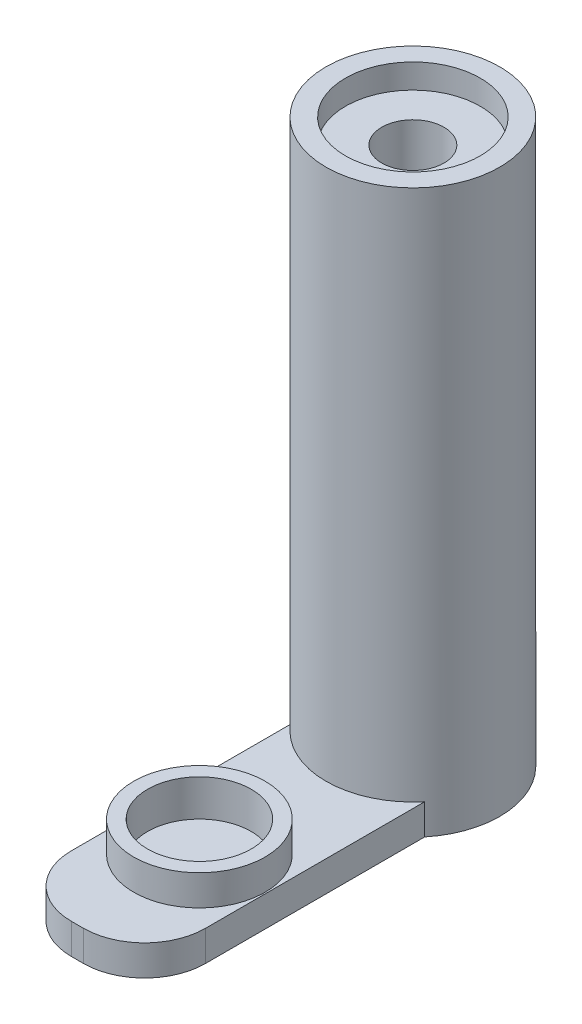
ISO-10303-21;
HEADER;
FILE_DESCRIPTION(('STEP AP214'),'2;1');
FILE_NAME('part.step','',(''),(''),'','','');
FILE_SCHEMA(('AUTOMOTIVE_DESIGN { 1 0 10303 214 1 1 1 1 }'));
ENDSEC;
DATA;
#1=APPLICATION_CONTEXT('core data for automotive mechanical design processes');
#2=APPLICATION_PROTOCOL_DEFINITION('international standard','automotive_design',2000,#1);
#3=PRODUCT_CONTEXT('',#1,'mechanical');
#4=PRODUCT('Part','Part','',(#3));
#5=PRODUCT_RELATED_PRODUCT_CATEGORY('part','',(#4));
#6=PRODUCT_DEFINITION_FORMATION('','',#4);
#7=PRODUCT_DEFINITION_CONTEXT('part definition',#1,'design');
#8=PRODUCT_DEFINITION('design','',#6,#7);
#9=PRODUCT_DEFINITION_SHAPE('','',#8);
#10=(LENGTH_UNIT() NAMED_UNIT(*) SI_UNIT(.MILLI.,.METRE.));
#11=(NAMED_UNIT(*) PLANE_ANGLE_UNIT() SI_UNIT($,.RADIAN.));
#12=(NAMED_UNIT(*) SI_UNIT($,.STERADIAN.) SOLID_ANGLE_UNIT());
#13=UNCERTAINTY_MEASURE_WITH_UNIT(LENGTH_MEASURE(1.E-05),#10,'distance_accuracy_value','');
#14=(GEOMETRIC_REPRESENTATION_CONTEXT(3) GLOBAL_UNCERTAINTY_ASSIGNED_CONTEXT((#13)) GLOBAL_UNIT_ASSIGNED_CONTEXT((#10,
#11,#12)) REPRESENTATION_CONTEXT('',''));
#15=CARTESIAN_POINT('',(0.,0.,0.));
#16=DIRECTION('',(0.,0.,1.));
#17=DIRECTION('',(1.,0.,0.));
#18=AXIS2_PLACEMENT_3D('',#15,#16,#17);
#19=CARTESIAN_POINT('',(0.,5.,0.));
#20=DIRECTION('',(0.,-1.,0.));
#21=DIRECTION('',(0.,0.,-1.));
#22=AXIS2_PLACEMENT_3D('',#19,#20,#21);
#23=PLANE('',#22);
#24=DIRECTION('',(0.,0.,-1.));
#25=VECTOR('',#24,1.);
#26=CARTESIAN_POINT('',(-11.,5.,55.));
#27=LINE('',#26,#25);
#28=CARTESIAN_POINT('',(-11.,5.,45.));
#29=VERTEX_POINT('',#28);
#30=CARTESIAN_POINT('',(-11.,5.,9.05883546599672));
#31=VERTEX_POINT('',#30);
#32=EDGE_CURVE('E119',#29,#31,#27,.T.);
#33=ORIENTED_EDGE('',*,*,#32,.F.);
#34=CARTESIAN_POINT('',(-1.,5.,45.));
#35=DIRECTION('',(0.,-1.,0.));
#36=DIRECTION('',(0.,0.,-1.));
#37=AXIS2_PLACEMENT_3D('',#34,#35,#36);
#38=CIRCLE('',#37,10.);
#39=CARTESIAN_POINT('',(-1.,5.,55.));
#40=VERTEX_POINT('',#39);
#41=EDGE_CURVE('E179',#29,#40,#38,.F.);
#42=ORIENTED_EDGE('',*,*,#41,.T.);
#43=DIRECTION('',(-1.,0.,0.));
#44=VECTOR('',#43,1.);
#45=CARTESIAN_POINT('',(-11.,5.,55.));
#46=LINE('',#45,#44);
#47=CARTESIAN_POINT('',(0.999999999999997,5.,55.));
#48=VERTEX_POINT('',#47);
#49=EDGE_CURVE('E184',#48,#40,#46,.T.);
#50=ORIENTED_EDGE('',*,*,#49,.F.);
#51=CARTESIAN_POINT('',(0.999999999999997,5.,45.));
#52=DIRECTION('',(0.,-1.,0.));
#53=DIRECTION('',(0.,0.,-1.));
#54=AXIS2_PLACEMENT_3D('',#51,#52,#53);
#55=CIRCLE('',#54,10.);
#56=CARTESIAN_POINT('',(11.,5.,45.));
#57=VERTEX_POINT('',#56);
#58=EDGE_CURVE('E55',#48,#57,#55,.F.);
#59=ORIENTED_EDGE('',*,*,#58,.T.);
#60=DIRECTION('',(0.,0.,1.));
#61=VECTOR('',#60,1.);
#62=CARTESIAN_POINT('',(11.,5.,55.));
#63=LINE('',#62,#61);
#64=CARTESIAN_POINT('',(11.,5.,9.05883546599672));
#65=VERTEX_POINT('',#64);
#66=EDGE_CURVE('E139',#65,#57,#63,.T.);
#67=ORIENTED_EDGE('',*,*,#66,.F.);
#68=CARTESIAN_POINT('',(0.,5.,0.));
#69=DIRECTION('',(0.,-1.,0.));
#70=DIRECTION('',(0.,0.,-1.));
#71=AXIS2_PLACEMENT_3D('',#68,#69,#70);
#72=CIRCLE('',#71,14.25);
#73=EDGE_CURVE('E115',#65,#31,#72,.T.);
#74=ORIENTED_EDGE('',*,*,#73,.T.);
#75=EDGE_LOOP('',(#33,#42,#50,#59,#67,#74));
#76=FACE_BOUND('',#75,.T.);
#77=CARTESIAN_POINT('',(0.,5.,35.));
#78=DIRECTION('',(0.,-1.,0.));
#79=DIRECTION('',(0.,0.,-1.));
#80=AXIS2_PLACEMENT_3D('',#77,#78,#79);
#81=CIRCLE('',#80,10.7734880242537);
#82=CARTESIAN_POINT('',(0.,5.,24.2265119757463));
#83=VERTEX_POINT('',#82);
#84=EDGE_CURVE('E11',#83,#83,#81,.F.);
#85=ORIENTED_EDGE('',*,*,#84,.F.);
#86=EDGE_LOOP('',(#85));
#87=FACE_BOUND('',#86,.T.);
#88=ADVANCED_FACE('F39',(#76,#87),#23,.F.);
#89=CARTESIAN_POINT('',(0.,0.,0.));
#90=DIRECTION('',(0.,1.,0.));
#91=DIRECTION('',(0.,0.,1.));
#92=AXIS2_PLACEMENT_3D('',#89,#90,#91);
#93=CYLINDRICAL_SURFACE('',#92,5.1);
#94=CARTESIAN_POINT('',(0.,88.2,0.));
#95=DIRECTION('',(0.,1.,0.));
#96=DIRECTION('',(0.,0.,1.));
#97=AXIS2_PLACEMENT_3D('',#94,#95,#96);
#98=CIRCLE('',#97,5.1);
#99=CARTESIAN_POINT('',(0.,88.2,5.1));
#100=VERTEX_POINT('',#99);
#101=EDGE_CURVE('E108',#100,#100,#98,.F.);
#102=ORIENTED_EDGE('',*,*,#101,.F.);
#103=EDGE_LOOP('',(#102));
#104=FACE_BOUND('',#103,.T.);
#105=CARTESIAN_POINT('',(0.,5.,0.));
#106=DIRECTION('',(0.,-1.,0.));
#107=DIRECTION('',(0.,0.,-1.));
#108=AXIS2_PLACEMENT_3D('',#105,#106,#107);
#109=CIRCLE('',#108,5.1);
#110=CARTESIAN_POINT('',(0.,5.,-5.1));
#111=VERTEX_POINT('',#110);
#112=EDGE_CURVE('E143',#111,#111,#109,.F.);
#113=ORIENTED_EDGE('',*,*,#112,.F.);
#114=EDGE_LOOP('',(#113));
#115=FACE_BOUND('',#114,.T.);
#116=ADVANCED_FACE('F214',(#104,#115),#93,.F.);
#117=CARTESIAN_POINT('',(0.,92.2,0.));
#118=DIRECTION('',(0.,-1.,0.));
#119=DIRECTION('',(0.,0.,-1.));
#120=AXIS2_PLACEMENT_3D('',#117,#118,#119);
#121=CYLINDRICAL_SURFACE('',#120,14.25);
#122=CARTESIAN_POINT('',(0.,0.,0.));
#123=DIRECTION('',(0.,1.,0.));
#124=DIRECTION('',(0.,0.,1.));
#125=AXIS2_PLACEMENT_3D('',#122,#123,#124);
#126=CIRCLE('',#125,14.25);
#127=CARTESIAN_POINT('',(11.,0.,9.05883546599672));
#128=VERTEX_POINT('',#127);
#129=CARTESIAN_POINT('',(-11.,0.,9.05883546599672));
#130=VERTEX_POINT('',#129);
#131=EDGE_CURVE('E96',#128,#130,#126,.T.);
#132=ORIENTED_EDGE('',*,*,#131,.T.);
#133=DIRECTION('',(0.,-1.,0.));
#134=VECTOR('',#133,1.);
#135=CARTESIAN_POINT('',(-11.,5.,9.05883546599672));
#136=LINE('',#135,#134);
#137=EDGE_CURVE('E118',#31,#130,#136,.T.);
#138=ORIENTED_EDGE('',*,*,#137,.F.);
#139=ORIENTED_EDGE('',*,*,#73,.F.);
#140=DIRECTION('',(0.,-1.,0.));
#141=VECTOR('',#140,1.);
#142=CARTESIAN_POINT('',(11.,5.,9.05883546599672));
#143=LINE('',#142,#141);
#144=EDGE_CURVE('E111',#65,#128,#143,.T.);
#145=ORIENTED_EDGE('',*,*,#144,.T.);
#146=EDGE_LOOP('',(#132,#138,#139,#145));
#147=FACE_BOUND('',#146,.T.);
#148=CARTESIAN_POINT('',(0.,92.2,0.));
#149=DIRECTION('',(0.,1.,0.));
#150=DIRECTION('',(0.,0.,1.));
#151=AXIS2_PLACEMENT_3D('',#148,#149,#150);
#152=CIRCLE('',#151,14.25);
#153=CARTESIAN_POINT('',(0.,92.2,14.25));
#154=VERTEX_POINT('',#153);
#155=EDGE_CURVE('E107',#154,#154,#152,.T.);
#156=ORIENTED_EDGE('',*,*,#155,.F.);
#157=EDGE_LOOP('',(#156));
#158=FACE_BOUND('',#157,.T.);
#159=ADVANCED_FACE('F112',(#147,#158),#121,.T.);
#160=CARTESIAN_POINT('',(0.,92.2,0.));
#161=DIRECTION('',(0.,1.,0.));
#162=DIRECTION('',(0.,0.,1.));
#163=AXIS2_PLACEMENT_3D('',#160,#161,#162);
#164=PLANE('',#163);
#165=CARTESIAN_POINT('',(0.,92.2,0.));
#166=DIRECTION('',(0.,1.,0.));
#167=DIRECTION('',(0.,0.,1.));
#168=AXIS2_PLACEMENT_3D('',#165,#166,#167);
#169=CIRCLE('',#168,11.05);
#170=CARTESIAN_POINT('',(0.,92.2,11.05));
#171=VERTEX_POINT('',#170);
#172=EDGE_CURVE('E141',#171,#171,#169,.T.);
#173=ORIENTED_EDGE('',*,*,#172,.F.);
#174=EDGE_LOOP('',(#173));
#175=FACE_BOUND('',#174,.T.);
#176=ORIENTED_EDGE('',*,*,#155,.T.);
#177=EDGE_LOOP('',(#176));
#178=FACE_BOUND('',#177,.T.);
#179=ADVANCED_FACE('F252',(#175,#178),#164,.T.);
#180=CARTESIAN_POINT('',(0.,0.,0.));
#181=DIRECTION('',(0.,1.,0.));
#182=DIRECTION('',(0.,0.,1.));
#183=AXIS2_PLACEMENT_3D('',#180,#181,#182);
#184=PLANE('',#183);
#185=DIRECTION('',(-1.,0.,0.));
#186=VECTOR('',#185,1.);
#187=CARTESIAN_POINT('',(-11.,0.,55.));
#188=LINE('',#187,#186);
#189=CARTESIAN_POINT('',(0.999999999999997,0.,55.));
#190=VERTEX_POINT('',#189);
#191=CARTESIAN_POINT('',(-1.,0.,55.));
#192=VERTEX_POINT('',#191);
#193=EDGE_CURVE('E125',#190,#192,#188,.T.);
#194=ORIENTED_EDGE('',*,*,#193,.T.);
#195=CARTESIAN_POINT('',(-1.,0.,45.));
#196=DIRECTION('',(0.,1.,0.));
#197=DIRECTION('',(0.,0.,1.));
#198=AXIS2_PLACEMENT_3D('',#195,#196,#197);
#199=CIRCLE('',#198,10.);
#200=CARTESIAN_POINT('',(-11.,0.,45.));
#201=VERTEX_POINT('',#200);
#202=EDGE_CURVE('E172',#192,#201,#199,.F.);
#203=ORIENTED_EDGE('',*,*,#202,.T.);
#204=DIRECTION('',(0.,0.,-1.));
#205=VECTOR('',#204,1.);
#206=CARTESIAN_POINT('',(-11.,0.,55.));
#207=LINE('',#206,#205);
#208=EDGE_CURVE('E102',#201,#130,#207,.T.);
#209=ORIENTED_EDGE('',*,*,#208,.T.);
#210=ORIENTED_EDGE('',*,*,#131,.F.);
#211=DIRECTION('',(0.,0.,1.));
#212=VECTOR('',#211,1.);
#213=CARTESIAN_POINT('',(11.,0.,55.));
#214=LINE('',#213,#212);
#215=CARTESIAN_POINT('',(11.,0.,45.));
#216=VERTEX_POINT('',#215);
#217=EDGE_CURVE('E101',#128,#216,#214,.T.);
#218=ORIENTED_EDGE('',*,*,#217,.T.);
#219=CARTESIAN_POINT('',(0.999999999999997,0.,45.));
#220=DIRECTION('',(0.,1.,0.));
#221=DIRECTION('',(0.,0.,1.));
#222=AXIS2_PLACEMENT_3D('',#219,#220,#221);
#223=CIRCLE('',#222,10.);
#224=EDGE_CURVE('E169',#216,#190,#223,.F.);
#225=ORIENTED_EDGE('',*,*,#224,.T.);
#226=EDGE_LOOP('',(#194,#203,#209,#210,#218,#225));
#227=FACE_BOUND('',#226,.T.);
#228=ADVANCED_FACE('F99',(#227),#184,.F.);
#229=CARTESIAN_POINT('',(0.,88.2,0.));
#230=DIRECTION('',(0.,1.,0.));
#231=DIRECTION('',(0.,0.,1.));
#232=AXIS2_PLACEMENT_3D('',#229,#230,#231);
#233=PLANE('',#232);
#234=CARTESIAN_POINT('',(0.,88.2,0.));
#235=DIRECTION('',(0.,1.,0.));
#236=DIRECTION('',(0.,0.,1.));
#237=AXIS2_PLACEMENT_3D('',#234,#235,#236);
#238=CIRCLE('',#237,11.05);
#239=CARTESIAN_POINT('',(0.,88.2,11.05));
#240=VERTEX_POINT('',#239);
#241=EDGE_CURVE('E148',#240,#240,#238,.T.);
#242=ORIENTED_EDGE('',*,*,#241,.T.);
#243=EDGE_LOOP('',(#242));
#244=FACE_BOUND('',#243,.T.);
#245=ORIENTED_EDGE('',*,*,#101,.T.);
#246=EDGE_LOOP('',(#245));
#247=FACE_BOUND('',#246,.T.);
#248=ADVANCED_FACE('F245',(#244,#247),#233,.T.);
#249=CARTESIAN_POINT('',(0.,88.2,0.));
#250=DIRECTION('',(0.,1.,0.));
#251=DIRECTION('',(0.,0.,1.));
#252=AXIS2_PLACEMENT_3D('',#249,#250,#251);
#253=CYLINDRICAL_SURFACE('',#252,11.05);
#254=ORIENTED_EDGE('',*,*,#241,.F.);
#255=EDGE_LOOP('',(#254));
#256=FACE_BOUND('',#255,.T.);
#257=ORIENTED_EDGE('',*,*,#172,.T.);
#258=EDGE_LOOP('',(#257));
#259=FACE_BOUND('',#258,.T.);
#260=ADVANCED_FACE('F244',(#256,#259),#253,.F.);
#261=CARTESIAN_POINT('',(11.,5.,55.));
#262=DIRECTION('',(1.,0.,0.));
#263=DIRECTION('',(0.,0.,-1.));
#264=AXIS2_PLACEMENT_3D('',#261,#262,#263);
#265=PLANE('',#264);
#266=ORIENTED_EDGE('',*,*,#66,.T.);
#267=DIRECTION('',(0.,-1.,0.));
#268=VECTOR('',#267,1.);
#269=CARTESIAN_POINT('',(11.,5.,45.));
#270=LINE('',#269,#268);
#271=EDGE_CURVE('E48',#57,#216,#270,.T.);
#272=ORIENTED_EDGE('',*,*,#271,.T.);
#273=ORIENTED_EDGE('',*,*,#217,.F.);
#274=ORIENTED_EDGE('',*,*,#144,.F.);
#275=EDGE_LOOP('',(#266,#272,#273,#274));
#276=FACE_BOUND('',#275,.T.);
#277=ADVANCED_FACE('F122',(#276),#265,.T.);
#278=CARTESIAN_POINT('',(-11.,5.,55.));
#279=DIRECTION('',(0.,0.,1.));
#280=DIRECTION('',(1.,0.,0.));
#281=AXIS2_PLACEMENT_3D('',#278,#279,#280);
#282=PLANE('',#281);
#283=ORIENTED_EDGE('',*,*,#49,.T.);
#284=DIRECTION('',(0.,-1.,0.));
#285=VECTOR('',#284,1.);
#286=CARTESIAN_POINT('',(-1.,5.,55.));
#287=LINE('',#286,#285);
#288=EDGE_CURVE('E165',#40,#192,#287,.T.);
#289=ORIENTED_EDGE('',*,*,#288,.T.);
#290=ORIENTED_EDGE('',*,*,#193,.F.);
#291=DIRECTION('',(0.,-1.,0.));
#292=VECTOR('',#291,1.);
#293=CARTESIAN_POINT('',(0.999999999999997,5.,55.));
#294=LINE('',#293,#292);
#295=EDGE_CURVE('E147',#190,#48,#294,.F.);
#296=ORIENTED_EDGE('',*,*,#295,.T.);
#297=EDGE_LOOP('',(#283,#289,#290,#296));
#298=FACE_BOUND('',#297,.T.);
#299=ADVANCED_FACE('F233',(#298),#282,.T.);
#300=CARTESIAN_POINT('',(-11.,5.,55.));
#301=DIRECTION('',(-1.,0.,0.));
#302=DIRECTION('',(0.,0.,1.));
#303=AXIS2_PLACEMENT_3D('',#300,#301,#302);
#304=PLANE('',#303);
#305=ORIENTED_EDGE('',*,*,#208,.F.);
#306=DIRECTION('',(0.,-1.,0.));
#307=VECTOR('',#306,1.);
#308=CARTESIAN_POINT('',(-11.,5.,45.));
#309=LINE('',#308,#307);
#310=EDGE_CURVE('E63',#201,#29,#309,.F.);
#311=ORIENTED_EDGE('',*,*,#310,.T.);
#312=ORIENTED_EDGE('',*,*,#32,.T.);
#313=ORIENTED_EDGE('',*,*,#137,.T.);
#314=EDGE_LOOP('',(#305,#311,#312,#313));
#315=FACE_BOUND('',#314,.T.);
#316=ADVANCED_FACE('F226',(#315),#304,.T.);
#317=ORIENTED_EDGE('',*,*,#112,.T.);
#318=EDGE_LOOP('',(#317));
#319=FACE_BOUND('',#318,.T.);
#320=ADVANCED_FACE('F216',(#319),#23,.F.);
#321=CARTESIAN_POINT('',(-1.,5.,45.));
#322=DIRECTION('',(0.,-1.,0.));
#323=DIRECTION('',(0.,0.,-1.));
#324=AXIS2_PLACEMENT_3D('',#321,#322,#323);
#325=CYLINDRICAL_SURFACE('',#324,10.);
#326=ORIENTED_EDGE('',*,*,#41,.F.);
#327=ORIENTED_EDGE('',*,*,#310,.F.);
#328=ORIENTED_EDGE('',*,*,#202,.F.);
#329=ORIENTED_EDGE('',*,*,#288,.F.);
#330=EDGE_LOOP('',(#326,#327,#328,#329));
#331=FACE_BOUND('',#330,.T.);
#332=ADVANCED_FACE('F211',(#331),#325,.T.);
#333=CARTESIAN_POINT('',(0.999999999999997,5.,45.));
#334=DIRECTION('',(0.,-1.,0.));
#335=DIRECTION('',(0.,0.,-1.));
#336=AXIS2_PLACEMENT_3D('',#333,#334,#335);
#337=CYLINDRICAL_SURFACE('',#336,10.);
#338=ORIENTED_EDGE('',*,*,#58,.F.);
#339=ORIENTED_EDGE('',*,*,#295,.F.);
#340=ORIENTED_EDGE('',*,*,#224,.F.);
#341=ORIENTED_EDGE('',*,*,#271,.F.);
#342=EDGE_LOOP('',(#338,#339,#340,#341));
#343=FACE_BOUND('',#342,.T.);
#344=ADVANCED_FACE('F41',(#343),#337,.T.);
#345=CARTESIAN_POINT('',(0.,10.,35.));
#346=DIRECTION('',(0.,1.,0.));
#347=DIRECTION('',(0.,0.,1.));
#348=AXIS2_PLACEMENT_3D('',#345,#346,#347);
#349=PLANE('',#348);
#350=CARTESIAN_POINT('',(0.,10.,35.));
#351=DIRECTION('',(0.,1.,0.));
#352=DIRECTION('',(0.,0.,1.));
#353=AXIS2_PLACEMENT_3D('',#350,#351,#352);
#354=CIRCLE('',#353,10.7734880242537);
#355=CARTESIAN_POINT('',(0.,10.,45.7734880242537));
#356=VERTEX_POINT('',#355);
#357=EDGE_CURVE('E132',#356,#356,#354,.T.);
#358=ORIENTED_EDGE('',*,*,#357,.T.);
#359=EDGE_LOOP('',(#358));
#360=FACE_BOUND('',#359,.T.);
#361=CARTESIAN_POINT('',(0.,10.,35.));
#362=DIRECTION('',(0.,1.,0.));
#363=DIRECTION('',(0.,0.,1.));
#364=AXIS2_PLACEMENT_3D('',#361,#362,#363);
#365=CIRCLE('',#364,8.5);
#366=CARTESIAN_POINT('',(0.,10.,43.5));
#367=VERTEX_POINT('',#366);
#368=EDGE_CURVE('E192',#367,#367,#365,.T.);
#369=ORIENTED_EDGE('',*,*,#368,.F.);
#370=EDGE_LOOP('',(#369));
#371=FACE_BOUND('',#370,.T.);
#372=ADVANCED_FACE('F199',(#360,#371),#349,.T.);
#373=CARTESIAN_POINT('',(0.,10.,35.));
#374=DIRECTION('',(0.,-1.,0.));
#375=DIRECTION('',(0.,0.,-1.));
#376=AXIS2_PLACEMENT_3D('',#373,#374,#375);
#377=CYLINDRICAL_SURFACE('',#376,10.7734880242537);
#378=ORIENTED_EDGE('',*,*,#357,.F.);
#379=EDGE_LOOP('',(#378));
#380=FACE_BOUND('',#379,.T.);
#381=ORIENTED_EDGE('',*,*,#84,.T.);
#382=EDGE_LOOP('',(#381));
#383=FACE_BOUND('',#382,.T.);
#384=ADVANCED_FACE('F201',(#380,#383),#377,.T.);
#385=CARTESIAN_POINT('',(0.,4.,35.));
#386=DIRECTION('',(0.,1.,0.));
#387=DIRECTION('',(0.,0.,1.));
#388=AXIS2_PLACEMENT_3D('',#385,#386,#387);
#389=PLANE('',#388);
#390=CARTESIAN_POINT('',(0.,4.,35.));
#391=DIRECTION('',(0.,1.,0.));
#392=DIRECTION('',(0.,0.,1.));
#393=AXIS2_PLACEMENT_3D('',#390,#391,#392);
#394=CIRCLE('',#393,8.5);
#395=CARTESIAN_POINT('',(0.,4.,43.5));
#396=VERTEX_POINT('',#395);
#397=EDGE_CURVE('E126',#396,#396,#394,.T.);
#398=ORIENTED_EDGE('',*,*,#397,.T.);
#399=EDGE_LOOP('',(#398));
#400=FACE_BOUND('',#399,.T.);
#401=ADVANCED_FACE('F208',(#400),#389,.T.);
#402=CARTESIAN_POINT('',(0.,4.,35.));
#403=DIRECTION('',(0.,1.,0.));
#404=DIRECTION('',(0.,0.,1.));
#405=AXIS2_PLACEMENT_3D('',#402,#403,#404);
#406=CYLINDRICAL_SURFACE('',#405,8.5);
#407=ORIENTED_EDGE('',*,*,#397,.F.);
#408=EDGE_LOOP('',(#407));
#409=FACE_BOUND('',#408,.T.);
#410=ORIENTED_EDGE('',*,*,#368,.T.);
#411=EDGE_LOOP('',(#410));
#412=FACE_BOUND('',#411,.T.);
#413=ADVANCED_FACE('F197',(#409,#412),#406,.F.);
#414=CLOSED_SHELL('',(#88,#116,#159,#179,#228,#248,#260,#277,#299,#316,#320,#332,#344,#372,#384,
#401,#413));
#415=MANIFOLD_SOLID_BREP('B2',#414);
#416=ADVANCED_BREP_SHAPE_REPRESENTATION('',(#18,#415),#14);
#417=SHAPE_DEFINITION_REPRESENTATION(#9,#416);
ENDSEC;
END-ISO-10303-21;
